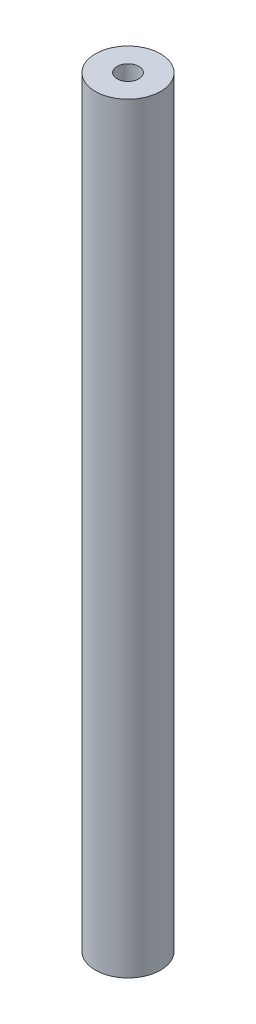
ISO-10303-21;
HEADER;
FILE_DESCRIPTION(('STEP AP214'),'2;1');
FILE_NAME('part.step','',(''),(''),'','','');
FILE_SCHEMA(('AUTOMOTIVE_DESIGN { 1 0 10303 214 1 1 1 1 }'));
ENDSEC;
DATA;
#1=APPLICATION_CONTEXT('core data for automotive mechanical design processes');
#2=APPLICATION_PROTOCOL_DEFINITION('international standard','automotive_design',2000,#1);
#3=PRODUCT_CONTEXT('',#1,'mechanical');
#4=PRODUCT('Part','Part','',(#3));
#5=PRODUCT_RELATED_PRODUCT_CATEGORY('part','',(#4));
#6=PRODUCT_DEFINITION_FORMATION('','',#4);
#7=PRODUCT_DEFINITION_CONTEXT('part definition',#1,'design');
#8=PRODUCT_DEFINITION('design','',#6,#7);
#9=PRODUCT_DEFINITION_SHAPE('','',#8);
#10=(LENGTH_UNIT() NAMED_UNIT(*) SI_UNIT(.MILLI.,.METRE.));
#11=(NAMED_UNIT(*) PLANE_ANGLE_UNIT() SI_UNIT($,.RADIAN.));
#12=(NAMED_UNIT(*) SI_UNIT($,.STERADIAN.) SOLID_ANGLE_UNIT());
#13=UNCERTAINTY_MEASURE_WITH_UNIT(LENGTH_MEASURE(1.E-05),#10,'distance_accuracy_value','');
#14=(GEOMETRIC_REPRESENTATION_CONTEXT(3) GLOBAL_UNCERTAINTY_ASSIGNED_CONTEXT((#13)) GLOBAL_UNIT_ASSIGNED_CONTEXT((#10,
#11,#12)) REPRESENTATION_CONTEXT('',''));
#15=CARTESIAN_POINT('',(0.,0.,0.));
#16=DIRECTION('',(0.,0.,1.));
#17=DIRECTION('',(1.,0.,0.));
#18=AXIS2_PLACEMENT_3D('',#15,#16,#17);
#19=CARTESIAN_POINT('',(0.,70.,-8.28558705575991));
#20=DIRECTION('',(0.,1.,0.));
#21=DIRECTION('',(0.,0.,1.));
#22=AXIS2_PLACEMENT_3D('',#19,#20,#21);
#23=PLANE('',#22);
#24=CARTESIAN_POINT('',(0.,70.,-8.28558705575991));
#25=DIRECTION('',(0.,1.,0.));
#26=DIRECTION('',(0.,0.,1.));
#27=AXIS2_PLACEMENT_3D('',#24,#25,#26);
#28=CIRCLE('',#27,3.);
#29=CARTESIAN_POINT('',(0.,70.,-5.28558705575991));
#30=VERTEX_POINT('',#29);
#31=EDGE_CURVE('E10',#30,#30,#28,.T.);
#32=ORIENTED_EDGE('',*,*,#31,.T.);
#33=EDGE_LOOP('',(#32));
#34=FACE_BOUND('',#33,.T.);
#35=CARTESIAN_POINT('',(0.,70.,-8.28558705575991));
#36=DIRECTION('',(0.,1.,0.));
#37=DIRECTION('',(0.,0.,1.));
#38=AXIS2_PLACEMENT_3D('',#35,#36,#37);
#39=CIRCLE('',#38,0.999999999999999);
#40=CARTESIAN_POINT('',(0.,70.,-7.28558705575991));
#41=VERTEX_POINT('',#40);
#42=EDGE_CURVE('E45',#41,#41,#39,.T.);
#43=ORIENTED_EDGE('',*,*,#42,.F.);
#44=EDGE_LOOP('',(#43));
#45=FACE_BOUND('',#44,.T.);
#46=ADVANCED_FACE('F34',(#34,#45),#23,.T.);
#47=CARTESIAN_POINT('',(0.,0.,-8.28558705575991));
#48=DIRECTION('',(0.,1.,0.));
#49=DIRECTION('',(0.,0.,1.));
#50=AXIS2_PLACEMENT_3D('',#47,#48,#49);
#51=PLANE('',#50);
#52=CARTESIAN_POINT('',(0.,0.,-8.28558705575991));
#53=DIRECTION('',(0.,1.,0.));
#54=DIRECTION('',(0.,0.,1.));
#55=AXIS2_PLACEMENT_3D('',#52,#53,#54);
#56=CIRCLE('',#55,3.);
#57=CARTESIAN_POINT('',(0.,0.,-5.28558705575991));
#58=VERTEX_POINT('',#57);
#59=EDGE_CURVE('E38',#58,#58,#56,.T.);
#60=ORIENTED_EDGE('',*,*,#59,.F.);
#61=EDGE_LOOP('',(#60));
#62=FACE_BOUND('',#61,.T.);
#63=CARTESIAN_POINT('',(0.,0.,-8.28558705575991));
#64=DIRECTION('',(0.,1.,0.));
#65=DIRECTION('',(0.,0.,1.));
#66=AXIS2_PLACEMENT_3D('',#63,#64,#65);
#67=CIRCLE('',#66,0.999999999999999);
#68=CARTESIAN_POINT('',(0.,0.,-7.28558705575991));
#69=VERTEX_POINT('',#68);
#70=EDGE_CURVE('E47',#69,#69,#67,.T.);
#71=ORIENTED_EDGE('',*,*,#70,.T.);
#72=EDGE_LOOP('',(#71));
#73=FACE_BOUND('',#72,.T.);
#74=ADVANCED_FACE('F57',(#62,#73),#51,.F.);
#75=CARTESIAN_POINT('',(0.,70.,-8.28558705575991));
#76=DIRECTION('',(0.,-1.,0.));
#77=DIRECTION('',(0.,0.,-1.));
#78=AXIS2_PLACEMENT_3D('',#75,#76,#77);
#79=CYLINDRICAL_SURFACE('',#78,3.);
#80=ORIENTED_EDGE('',*,*,#31,.F.);
#81=EDGE_LOOP('',(#80));
#82=FACE_BOUND('',#81,.T.);
#83=ORIENTED_EDGE('',*,*,#59,.T.);
#84=EDGE_LOOP('',(#83));
#85=FACE_BOUND('',#84,.T.);
#86=ADVANCED_FACE('F36',(#82,#85),#79,.T.);
#87=CARTESIAN_POINT('',(0.,70.,-8.28558705575991));
#88=DIRECTION('',(0.,-1.,0.));
#89=DIRECTION('',(0.,0.,-1.));
#90=AXIS2_PLACEMENT_3D('',#87,#88,#89);
#91=CYLINDRICAL_SURFACE('',#90,0.999999999999999);
#92=ORIENTED_EDGE('',*,*,#42,.T.);
#93=EDGE_LOOP('',(#92));
#94=FACE_BOUND('',#93,.T.);
#95=ORIENTED_EDGE('',*,*,#70,.F.);
#96=EDGE_LOOP('',(#95));
#97=FACE_BOUND('',#96,.T.);
#98=ADVANCED_FACE('F53',(#94,#97),#91,.F.);
#99=CLOSED_SHELL('',(#46,#74,#86,#98));
#100=MANIFOLD_SOLID_BREP('B2',#99);
#101=ADVANCED_BREP_SHAPE_REPRESENTATION('',(#18,#100),#14);
#102=SHAPE_DEFINITION_REPRESENTATION(#9,#101);
ENDSEC;
END-ISO-10303-21;
